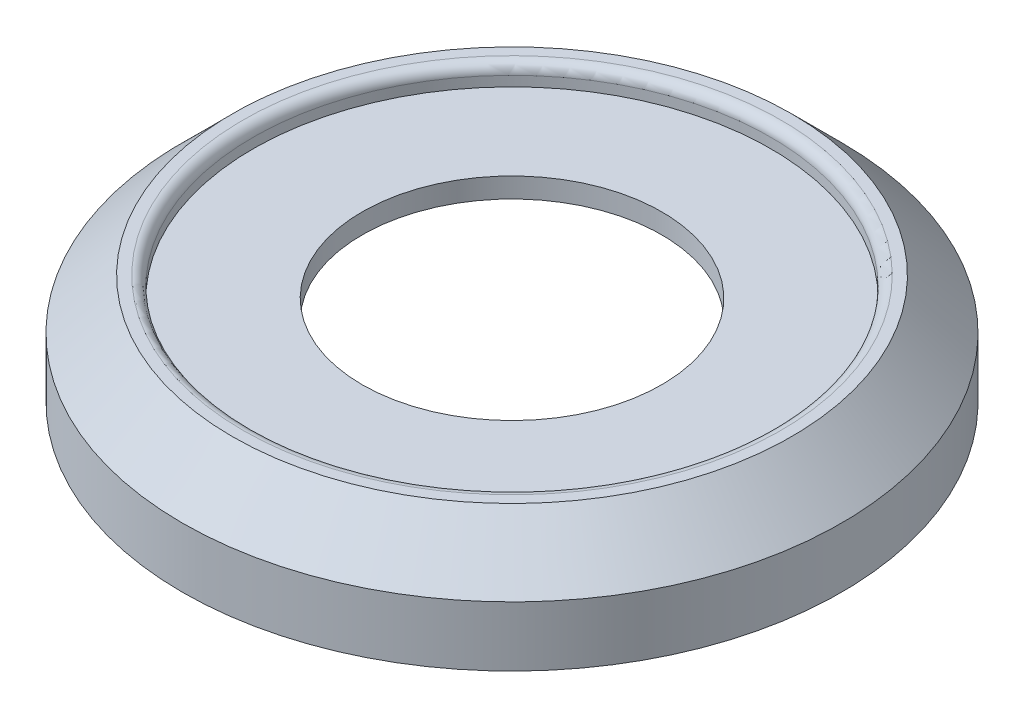
ISO-10303-21;
HEADER;
FILE_DESCRIPTION(('STEP AP214'),'2;1');
FILE_NAME('part.step','',(''),(''),'','','');
FILE_SCHEMA(('AUTOMOTIVE_DESIGN { 1 0 10303 214 1 1 1 1 }'));
ENDSEC;
DATA;
#1=APPLICATION_CONTEXT('core data for automotive mechanical design processes');
#2=APPLICATION_PROTOCOL_DEFINITION('international standard','automotive_design',2000,#1);
#3=PRODUCT_CONTEXT('',#1,'mechanical');
#4=PRODUCT('Part','Part','',(#3));
#5=PRODUCT_RELATED_PRODUCT_CATEGORY('part','',(#4));
#6=PRODUCT_DEFINITION_FORMATION('','',#4);
#7=PRODUCT_DEFINITION_CONTEXT('part definition',#1,'design');
#8=PRODUCT_DEFINITION('design','',#6,#7);
#9=PRODUCT_DEFINITION_SHAPE('','',#8);
#10=(LENGTH_UNIT() NAMED_UNIT(*) SI_UNIT(.MILLI.,.METRE.));
#11=(NAMED_UNIT(*) PLANE_ANGLE_UNIT() SI_UNIT($,.RADIAN.));
#12=(NAMED_UNIT(*) SI_UNIT($,.STERADIAN.) SOLID_ANGLE_UNIT());
#13=UNCERTAINTY_MEASURE_WITH_UNIT(LENGTH_MEASURE(1.E-05),#10,'distance_accuracy_value','');
#14=(GEOMETRIC_REPRESENTATION_CONTEXT(3) GLOBAL_UNCERTAINTY_ASSIGNED_CONTEXT((#13)) GLOBAL_UNIT_ASSIGNED_CONTEXT((#10,
#11,#12)) REPRESENTATION_CONTEXT('',''));
#15=CARTESIAN_POINT('',(0.,0.,0.));
#16=DIRECTION('',(0.,0.,1.));
#17=DIRECTION('',(1.,0.,0.));
#18=AXIS2_PLACEMENT_3D('',#15,#16,#17);
#19=CARTESIAN_POINT('',(0.,11.,0.));
#20=DIRECTION('',(0.,-1.,0.));
#21=DIRECTION('',(0.,0.,-1.));
#22=AXIS2_PLACEMENT_3D('',#19,#20,#21);
#23=CYLINDRICAL_SURFACE('',#22,33.);
#24=CARTESIAN_POINT('',(0.,5.99999999999998,0.));
#25=DIRECTION('',(0.,1.,0.));
#26=DIRECTION('',(0.,0.,1.));
#27=AXIS2_PLACEMENT_3D('',#24,#25,#26);
#28=CIRCLE('',#27,33.);
#29=CARTESIAN_POINT('',(0.,5.99999999999998,33.));
#30=VERTEX_POINT('',#29);
#31=EDGE_CURVE('E10',#30,#30,#28,.F.);
#32=ORIENTED_EDGE('',*,*,#31,.T.);
#33=EDGE_LOOP('',(#32));
#34=FACE_BOUND('',#33,.T.);
#35=CARTESIAN_POINT('',(0.,0.,0.));
#36=DIRECTION('',(0.,1.,0.));
#37=DIRECTION('',(0.,0.,1.));
#38=AXIS2_PLACEMENT_3D('',#35,#36,#37);
#39=CIRCLE('',#38,33.);
#40=CARTESIAN_POINT('',(0.,0.,33.));
#41=VERTEX_POINT('',#40);
#42=EDGE_CURVE('E51',#41,#41,#39,.T.);
#43=ORIENTED_EDGE('',*,*,#42,.T.);
#44=EDGE_LOOP('',(#43));
#45=FACE_BOUND('',#44,.T.);
#46=ADVANCED_FACE('F31',(#34,#45),#23,.T.);
#47=CARTESIAN_POINT('',(0.,11.,0.));
#48=DIRECTION('',(0.,1.,0.));
#49=DIRECTION('',(0.,0.,1.));
#50=AXIS2_PLACEMENT_3D('',#47,#48,#49);
#51=PLANE('',#50);
#52=CARTESIAN_POINT('',(0.,11.,0.));
#53=DIRECTION('',(0.,1.,0.));
#54=DIRECTION('',(0.,0.,1.));
#55=AXIS2_PLACEMENT_3D('',#52,#53,#54);
#56=CIRCLE('',#55,28.);
#57=CARTESIAN_POINT('',(0.,11.,28.));
#58=VERTEX_POINT('',#57);
#59=EDGE_CURVE('E38',#58,#58,#56,.T.);
#60=ORIENTED_EDGE('',*,*,#59,.T.);
#61=EDGE_LOOP('',(#60));
#62=FACE_BOUND('',#61,.T.);
#63=CARTESIAN_POINT('',(0.,11.,0.));
#64=DIRECTION('',(0.,1.,0.));
#65=DIRECTION('',(0.,0.,1.));
#66=AXIS2_PLACEMENT_3D('',#63,#64,#65);
#67=CIRCLE('',#66,26.925);
#68=CARTESIAN_POINT('',(0.,11.,26.925));
#69=VERTEX_POINT('',#68);
#70=EDGE_CURVE('E42',#69,#69,#67,.F.);
#71=ORIENTED_EDGE('',*,*,#70,.T.);
#72=EDGE_LOOP('',(#71));
#73=FACE_BOUND('',#72,.T.);
#74=ADVANCED_FACE('F96',(#62,#73),#51,.T.);
#75=CARTESIAN_POINT('',(0.,0.,0.));
#76=DIRECTION('',(0.,1.,0.));
#77=DIRECTION('',(0.,0.,1.));
#78=AXIS2_PLACEMENT_3D('',#75,#76,#77);
#79=PLANE('',#78);
#80=CARTESIAN_POINT('',(0.,0.,0.));
#81=DIRECTION('',(0.,-1.,0.));
#82=DIRECTION('',(0.,0.,-1.));
#83=AXIS2_PLACEMENT_3D('',#80,#81,#82);
#84=CIRCLE('',#83,31.);
#85=CARTESIAN_POINT('',(0.,0.,-31.));
#86=VERTEX_POINT('',#85);
#87=EDGE_CURVE('E55',#86,#86,#84,.T.);
#88=ORIENTED_EDGE('',*,*,#87,.F.);
#89=EDGE_LOOP('',(#88));
#90=FACE_BOUND('',#89,.T.);
#91=ORIENTED_EDGE('',*,*,#42,.F.);
#92=EDGE_LOOP('',(#91));
#93=FACE_BOUND('',#92,.T.);
#94=ADVANCED_FACE('F101',(#90,#93),#79,.F.);
#95=CARTESIAN_POINT('',(0.,7.,0.));
#96=DIRECTION('',(0.,-1.,0.));
#97=DIRECTION('',(0.,0.,-1.));
#98=AXIS2_PLACEMENT_3D('',#95,#96,#97);
#99=CYLINDRICAL_SURFACE('',#98,31.);
#100=CARTESIAN_POINT('',(0.,7.,0.));
#101=DIRECTION('',(0.,-1.,0.));
#102=DIRECTION('',(0.,0.,-1.));
#103=AXIS2_PLACEMENT_3D('',#100,#101,#102);
#104=CIRCLE('',#103,31.);
#105=CARTESIAN_POINT('',(0.,7.,-31.));
#106=VERTEX_POINT('',#105);
#107=EDGE_CURVE('E54',#106,#106,#104,.T.);
#108=ORIENTED_EDGE('',*,*,#107,.F.);
#109=EDGE_LOOP('',(#108));
#110=FACE_BOUND('',#109,.T.);
#111=ORIENTED_EDGE('',*,*,#87,.T.);
#112=EDGE_LOOP('',(#111));
#113=FACE_BOUND('',#112,.T.);
#114=ADVANCED_FACE('F93',(#110,#113),#99,.F.);
#115=CARTESIAN_POINT('',(0.,7.,0.));
#116=DIRECTION('',(0.,-1.,0.));
#117=DIRECTION('',(0.,0.,-1.));
#118=AXIS2_PLACEMENT_3D('',#115,#116,#117);
#119=PLANE('',#118);
#120=CARTESIAN_POINT('',(0.,7.,0.));
#121=DIRECTION('',(0.,1.,0.));
#122=DIRECTION('',(0.,0.,1.));
#123=AXIS2_PLACEMENT_3D('',#120,#121,#122);
#124=CIRCLE('',#123,15.);
#125=CARTESIAN_POINT('',(0.,7.,15.));
#126=VERTEX_POINT('',#125);
#127=EDGE_CURVE('E63',#126,#126,#124,.T.);
#128=ORIENTED_EDGE('',*,*,#127,.T.);
#129=EDGE_LOOP('',(#128));
#130=FACE_BOUND('',#129,.T.);
#131=ORIENTED_EDGE('',*,*,#107,.T.);
#132=EDGE_LOOP('',(#131));
#133=FACE_BOUND('',#132,.T.);
#134=ADVANCED_FACE('F70',(#130,#133),#119,.T.);
#135=CARTESIAN_POINT('',(0.,9.,0.));
#136=DIRECTION('',(0.,1.,0.));
#137=DIRECTION('',(0.,0.,1.));
#138=AXIS2_PLACEMENT_3D('',#135,#136,#137);
#139=CYLINDRICAL_SURFACE('',#138,25.925);
#140=CARTESIAN_POINT('',(0.,10.,0.));
#141=DIRECTION('',(0.,1.,0.));
#142=DIRECTION('',(0.,0.,1.));
#143=AXIS2_PLACEMENT_3D('',#140,#141,#142);
#144=CIRCLE('',#143,25.925);
#145=CARTESIAN_POINT('',(0.,10.,25.925));
#146=VERTEX_POINT('',#145);
#147=EDGE_CURVE('E46',#146,#146,#144,.T.);
#148=ORIENTED_EDGE('',*,*,#147,.T.);
#149=EDGE_LOOP('',(#148));
#150=FACE_BOUND('',#149,.T.);
#151=CARTESIAN_POINT('',(0.,9.,0.));
#152=DIRECTION('',(0.,1.,0.));
#153=DIRECTION('',(0.,0.,1.));
#154=AXIS2_PLACEMENT_3D('',#151,#152,#153);
#155=CIRCLE('',#154,25.925);
#156=CARTESIAN_POINT('',(0.,9.,25.925));
#157=VERTEX_POINT('',#156);
#158=EDGE_CURVE('E58',#157,#157,#155,.T.);
#159=ORIENTED_EDGE('',*,*,#158,.F.);
#160=EDGE_LOOP('',(#159));
#161=FACE_BOUND('',#160,.T.);
#162=ADVANCED_FACE('F83',(#150,#161),#139,.F.);
#163=CARTESIAN_POINT('',(0.,9.,0.));
#164=DIRECTION('',(0.,1.,0.));
#165=DIRECTION('',(0.,0.,1.));
#166=AXIS2_PLACEMENT_3D('',#163,#164,#165);
#167=PLANE('',#166);
#168=CARTESIAN_POINT('',(0.,9.,0.));
#169=DIRECTION('',(0.,1.,0.));
#170=DIRECTION('',(0.,0.,1.));
#171=AXIS2_PLACEMENT_3D('',#168,#169,#170);
#172=CIRCLE('',#171,15.);
#173=CARTESIAN_POINT('',(0.,9.,15.));
#174=VERTEX_POINT('',#173);
#175=EDGE_CURVE('E64',#174,#174,#172,.T.);
#176=ORIENTED_EDGE('',*,*,#175,.F.);
#177=EDGE_LOOP('',(#176));
#178=FACE_BOUND('',#177,.T.);
#179=ORIENTED_EDGE('',*,*,#158,.T.);
#180=EDGE_LOOP('',(#179));
#181=FACE_BOUND('',#180,.T.);
#182=ADVANCED_FACE('F79',(#178,#181),#167,.T.);
#183=CARTESIAN_POINT('',(0.,10.,0.));
#184=DIRECTION('',(0.,1.,0.));
#185=DIRECTION('',(0.,0.,1.));
#186=AXIS2_PLACEMENT_3D('',#183,#184,#185);
#187=TOROIDAL_SURFACE('',#186,26.925,1.);
#188=ORIENTED_EDGE('',*,*,#70,.F.);
#189=EDGE_LOOP('',(#188));
#190=FACE_BOUND('',#189,.T.);
#191=ORIENTED_EDGE('',*,*,#147,.F.);
#192=EDGE_LOOP('',(#191));
#193=FACE_BOUND('',#192,.T.);
#194=ADVANCED_FACE('F82',(#190,#193),#187,.T.);
#195=CARTESIAN_POINT('',(0.,11.,0.));
#196=DIRECTION('',(0.,-1.,0.));
#197=DIRECTION('',(0.,0.,-1.));
#198=AXIS2_PLACEMENT_3D('',#195,#196,#197);
#199=CONICAL_SURFACE('',#198,28.,0.785398163397446);
#200=ORIENTED_EDGE('',*,*,#31,.F.);
#201=EDGE_LOOP('',(#200));
#202=FACE_BOUND('',#201,.T.);
#203=ORIENTED_EDGE('',*,*,#59,.F.);
#204=EDGE_LOOP('',(#203));
#205=FACE_BOUND('',#204,.T.);
#206=ADVANCED_FACE('F33',(#202,#205),#199,.T.);
#207=CARTESIAN_POINT('',(0.,7.,0.));
#208=DIRECTION('',(0.,1.,0.));
#209=DIRECTION('',(0.,0.,1.));
#210=AXIS2_PLACEMENT_3D('',#207,#208,#209);
#211=CYLINDRICAL_SURFACE('',#210,15.);
#212=ORIENTED_EDGE('',*,*,#127,.F.);
#213=EDGE_LOOP('',(#212));
#214=FACE_BOUND('',#213,.T.);
#215=ORIENTED_EDGE('',*,*,#175,.T.);
#216=EDGE_LOOP('',(#215));
#217=FACE_BOUND('',#216,.T.);
#218=ADVANCED_FACE('F73',(#214,#217),#211,.F.);
#219=CLOSED_SHELL('',(#46,#74,#94,#114,#134,#162,#182,#194,#206,#218));
#220=MANIFOLD_SOLID_BREP('B2',#219);
#221=ADVANCED_BREP_SHAPE_REPRESENTATION('',(#18,#220),#14);
#222=SHAPE_DEFINITION_REPRESENTATION(#9,#221);
ENDSEC;
END-ISO-10303-21;
